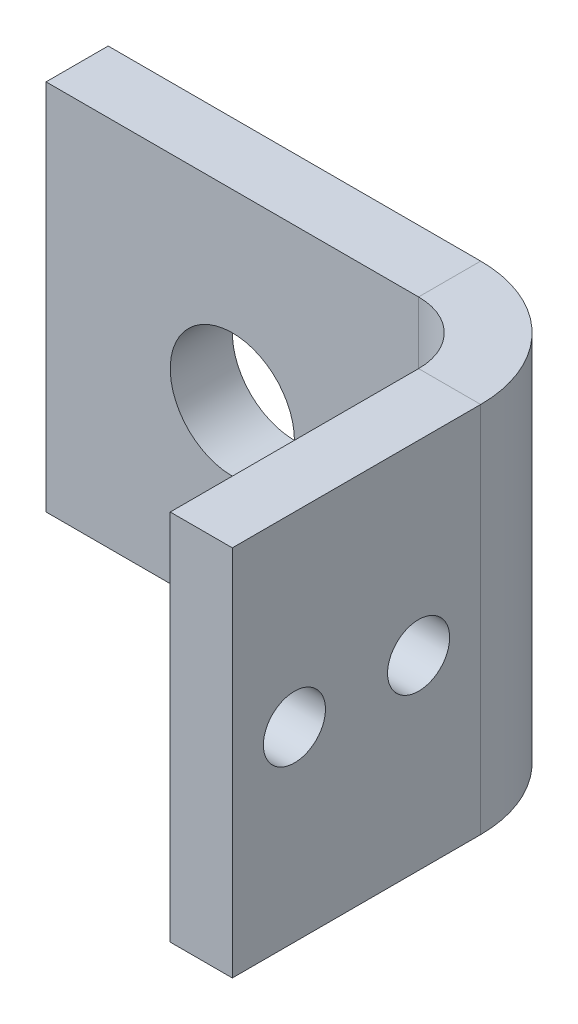
ISO-10303-21;
HEADER;
FILE_DESCRIPTION(('STEP AP214'),'2;1');
FILE_NAME('part.step','',(''),(''),'','','');
FILE_SCHEMA(('AUTOMOTIVE_DESIGN { 1 0 10303 214 1 1 1 1 }'));
ENDSEC;
DATA;
#1=APPLICATION_CONTEXT('core data for automotive mechanical design processes');
#2=APPLICATION_PROTOCOL_DEFINITION('international standard','automotive_design',2000,#1);
#3=PRODUCT_CONTEXT('',#1,'mechanical');
#4=PRODUCT('Part','Part','',(#3));
#5=PRODUCT_RELATED_PRODUCT_CATEGORY('part','',(#4));
#6=PRODUCT_DEFINITION_FORMATION('','',#4);
#7=PRODUCT_DEFINITION_CONTEXT('part definition',#1,'design');
#8=PRODUCT_DEFINITION('design','',#6,#7);
#9=PRODUCT_DEFINITION_SHAPE('','',#8);
#10=(LENGTH_UNIT() NAMED_UNIT(*) SI_UNIT(.MILLI.,.METRE.));
#11=(NAMED_UNIT(*) PLANE_ANGLE_UNIT() SI_UNIT($,.RADIAN.));
#12=(NAMED_UNIT(*) SI_UNIT($,.STERADIAN.) SOLID_ANGLE_UNIT());
#13=UNCERTAINTY_MEASURE_WITH_UNIT(LENGTH_MEASURE(1.E-05),#10,'distance_accuracy_value','');
#14=(GEOMETRIC_REPRESENTATION_CONTEXT(3) GLOBAL_UNCERTAINTY_ASSIGNED_CONTEXT((#13)) GLOBAL_UNIT_ASSIGNED_CONTEXT((#10,
#11,#12)) REPRESENTATION_CONTEXT('',''));
#15=CARTESIAN_POINT('',(0.,0.,0.));
#16=DIRECTION('',(0.,0.,1.));
#17=DIRECTION('',(1.,0.,0.));
#18=AXIS2_PLACEMENT_3D('',#15,#16,#17);
#19=CARTESIAN_POINT('',(-30.,-15.,-5.));
#20=DIRECTION('',(0.,-1.,0.));
#21=DIRECTION('',(1.,0.,0.));
#22=AXIS2_PLACEMENT_3D('',#19,#20,#21);
#23=PLANE('',#22);
#24=DIRECTION('',(1.,0.,0.));
#25=VECTOR('',#24,1.);
#26=CARTESIAN_POINT('',(-30.,-15.,0.));
#27=LINE('',#26,#25);
#28=CARTESIAN_POINT('',(-30.,-15.,0.));
#29=VERTEX_POINT('',#28);
#30=CARTESIAN_POINT('',(0.,-15.,0.));
#31=VERTEX_POINT('',#30);
#32=EDGE_CURVE('E200',#29,#31,#27,.T.);
#33=ORIENTED_EDGE('',*,*,#32,.F.);
#34=DIRECTION('',(0.,0.,1.));
#35=VECTOR('',#34,1.);
#36=CARTESIAN_POINT('',(-30.,-15.,-5.));
#37=LINE('',#36,#35);
#38=CARTESIAN_POINT('',(-30.,-15.,-5.));
#39=VERTEX_POINT('',#38);
#40=EDGE_CURVE('E73',#39,#29,#37,.T.);
#41=ORIENTED_EDGE('',*,*,#40,.F.);
#42=DIRECTION('',(1.,0.,0.));
#43=VECTOR('',#42,1.);
#44=CARTESIAN_POINT('',(-30.,-15.,-5.));
#45=LINE('',#44,#43);
#46=CARTESIAN_POINT('',(0.,-15.,-5.));
#47=VERTEX_POINT('',#46);
#48=EDGE_CURVE('E205',#39,#47,#45,.T.);
#49=ORIENTED_EDGE('',*,*,#48,.T.);
#50=DIRECTION('',(0.,0.,1.));
#51=VECTOR('',#50,1.);
#52=CARTESIAN_POINT('',(0.,-15.,-5.));
#53=LINE('',#52,#51);
#54=EDGE_CURVE('E13',#47,#31,#53,.T.);
#55=ORIENTED_EDGE('',*,*,#54,.T.);
#56=EDGE_LOOP('',(#33,#41,#49,#55));
#57=FACE_BOUND('',#56,.T.);
#58=ADVANCED_FACE('F63',(#57),#23,.T.);
#59=CARTESIAN_POINT('',(-30.,15.,-5.));
#60=DIRECTION('',(-1.,0.,0.));
#61=DIRECTION('',(0.,-1.,0.));
#62=AXIS2_PLACEMENT_3D('',#59,#60,#61);
#63=PLANE('',#62);
#64=DIRECTION('',(0.,-1.,0.));
#65=VECTOR('',#64,1.);
#66=CARTESIAN_POINT('',(-30.,15.,0.));
#67=LINE('',#66,#65);
#68=CARTESIAN_POINT('',(-30.,15.,0.));
#69=VERTEX_POINT('',#68);
#70=EDGE_CURVE('E212',#69,#29,#67,.T.);
#71=ORIENTED_EDGE('',*,*,#70,.F.);
#72=DIRECTION('',(0.,0.,1.));
#73=VECTOR('',#72,1.);
#74=CARTESIAN_POINT('',(-30.,15.,-5.));
#75=LINE('',#74,#73);
#76=CARTESIAN_POINT('',(-30.,15.,-5.));
#77=VERTEX_POINT('',#76);
#78=EDGE_CURVE('E106',#77,#69,#75,.T.);
#79=ORIENTED_EDGE('',*,*,#78,.F.);
#80=DIRECTION('',(0.,-1.,0.));
#81=VECTOR('',#80,1.);
#82=CARTESIAN_POINT('',(-30.,15.,-5.));
#83=LINE('',#82,#81);
#84=EDGE_CURVE('E203',#77,#39,#83,.T.);
#85=ORIENTED_EDGE('',*,*,#84,.T.);
#86=ORIENTED_EDGE('',*,*,#40,.T.);
#87=EDGE_LOOP('',(#71,#79,#85,#86));
#88=FACE_BOUND('',#87,.T.);
#89=ADVANCED_FACE('F267',(#88),#63,.T.);
#90=CARTESIAN_POINT('',(-30.,15.,-5.));
#91=DIRECTION('',(0.,1.,0.));
#92=DIRECTION('',(-1.,0.,0.));
#93=AXIS2_PLACEMENT_3D('',#90,#91,#92);
#94=PLANE('',#93);
#95=DIRECTION('',(-1.,0.,0.));
#96=VECTOR('',#95,1.);
#97=CARTESIAN_POINT('',(-30.,15.,0.));
#98=LINE('',#97,#96);
#99=CARTESIAN_POINT('',(0.,15.,0.));
#100=VERTEX_POINT('',#99);
#101=EDGE_CURVE('E209',#100,#69,#98,.T.);
#102=ORIENTED_EDGE('',*,*,#101,.F.);
#103=DIRECTION('',(0.,0.,1.));
#104=VECTOR('',#103,1.);
#105=CARTESIAN_POINT('',(0.,15.,-5.));
#106=LINE('',#105,#104);
#107=CARTESIAN_POINT('',(0.,15.,-5.));
#108=VERTEX_POINT('',#107);
#109=EDGE_CURVE('E67',#108,#100,#106,.T.);
#110=ORIENTED_EDGE('',*,*,#109,.F.);
#111=DIRECTION('',(-1.,0.,0.));
#112=VECTOR('',#111,1.);
#113=CARTESIAN_POINT('',(-30.,15.,-5.));
#114=LINE('',#113,#112);
#115=EDGE_CURVE('E199',#108,#77,#114,.T.);
#116=ORIENTED_EDGE('',*,*,#115,.T.);
#117=ORIENTED_EDGE('',*,*,#78,.T.);
#118=EDGE_LOOP('',(#102,#110,#116,#117));
#119=FACE_BOUND('',#118,.T.);
#120=ADVANCED_FACE('F65',(#119),#94,.T.);
#121=CARTESIAN_POINT('',(0.,0.,-5.));
#122=DIRECTION('',(0.,0.,1.));
#123=DIRECTION('',(1.,0.,0.));
#124=AXIS2_PLACEMENT_3D('',#121,#122,#123);
#125=PLANE('',#124);
#126=CARTESIAN_POINT('',(-15.,0.,-5.));
#127=DIRECTION('',(0.,0.,1.));
#128=DIRECTION('',(1.,0.,0.));
#129=AXIS2_PLACEMENT_3D('',#126,#127,#128);
#130=CIRCLE('',#129,5.);
#131=CARTESIAN_POINT('',(-9.99999999999999,0.,-5.));
#132=VERTEX_POINT('',#131);
#133=EDGE_CURVE('E192',#132,#132,#130,.T.);
#134=ORIENTED_EDGE('',*,*,#133,.T.);
#135=EDGE_LOOP('',(#134));
#136=FACE_BOUND('',#135,.T.);
#137=DIRECTION('',(0.,1.,0.));
#138=VECTOR('',#137,1.);
#139=CARTESIAN_POINT('',(0.,15.,-5.));
#140=LINE('',#139,#138);
#141=EDGE_CURVE('E82',#47,#108,#140,.T.);
#142=ORIENTED_EDGE('',*,*,#141,.F.);
#143=ORIENTED_EDGE('',*,*,#48,.F.);
#144=ORIENTED_EDGE('',*,*,#84,.F.);
#145=ORIENTED_EDGE('',*,*,#115,.F.);
#146=EDGE_LOOP('',(#142,#143,#144,#145));
#147=FACE_BOUND('',#146,.T.);
#148=ADVANCED_FACE('F279',(#136,#147),#125,.F.);
#149=CARTESIAN_POINT('',(0.,0.,0.));
#150=DIRECTION('',(0.,0.,1.));
#151=DIRECTION('',(1.,0.,0.));
#152=AXIS2_PLACEMENT_3D('',#149,#150,#151);
#153=PLANE('',#152);
#154=CARTESIAN_POINT('',(-15.,0.,0.));
#155=DIRECTION('',(0.,0.,1.));
#156=DIRECTION('',(1.,0.,0.));
#157=AXIS2_PLACEMENT_3D('',#154,#155,#156);
#158=CIRCLE('',#157,5.);
#159=CARTESIAN_POINT('',(-9.99999999999999,0.,0.));
#160=VERTEX_POINT('',#159);
#161=EDGE_CURVE('E182',#160,#160,#158,.T.);
#162=ORIENTED_EDGE('',*,*,#161,.F.);
#163=EDGE_LOOP('',(#162));
#164=FACE_BOUND('',#163,.T.);
#165=DIRECTION('',(0.,1.,0.));
#166=VECTOR('',#165,1.);
#167=CARTESIAN_POINT('',(0.,15.,0.));
#168=LINE('',#167,#166);
#169=EDGE_CURVE('E195',#31,#100,#168,.T.);
#170=ORIENTED_EDGE('',*,*,#169,.T.);
#171=ORIENTED_EDGE('',*,*,#101,.T.);
#172=ORIENTED_EDGE('',*,*,#70,.T.);
#173=ORIENTED_EDGE('',*,*,#32,.T.);
#174=EDGE_LOOP('',(#170,#171,#172,#173));
#175=FACE_BOUND('',#174,.T.);
#176=ADVANCED_FACE('F275',(#164,#175),#153,.T.);
#177=CARTESIAN_POINT('',(-15.,0.,-5.));
#178=DIRECTION('',(0.,0.,1.));
#179=DIRECTION('',(1.,0.,0.));
#180=AXIS2_PLACEMENT_3D('',#177,#178,#179);
#181=CYLINDRICAL_SURFACE('',#180,5.);
#182=ORIENTED_EDGE('',*,*,#133,.F.);
#183=EDGE_LOOP('',(#182));
#184=FACE_BOUND('',#183,.T.);
#185=ORIENTED_EDGE('',*,*,#161,.T.);
#186=EDGE_LOOP('',(#185));
#187=FACE_BOUND('',#186,.T.);
#188=ADVANCED_FACE('F278',(#184,#187),#181,.F.);
#189=CARTESIAN_POINT('',(0.,-15.,5.));
#190=DIRECTION('',(0.,-1.,0.));
#191=DIRECTION('',(1.,0.,0.));
#192=AXIS2_PLACEMENT_3D('',#189,#190,#191);
#193=PLANE('',#192);
#194=DIRECTION('',(-1.,0.,0.));
#195=VECTOR('',#194,1.);
#196=CARTESIAN_POINT('',(10.,-15.,4.99999999999997));
#197=LINE('',#196,#195);
#198=CARTESIAN_POINT('',(5.,-15.,4.99999999999998));
#199=VERTEX_POINT('',#198);
#200=CARTESIAN_POINT('',(10.,-15.,4.99999999999997));
#201=VERTEX_POINT('',#200);
#202=EDGE_CURVE('E160',#199,#201,#197,.F.);
#203=ORIENTED_EDGE('',*,*,#202,.F.);
#204=CARTESIAN_POINT('',(0.,-15.,5.));
#205=DIRECTION('',(0.,1.,0.));
#206=DIRECTION('',(-1.,0.,0.));
#207=AXIS2_PLACEMENT_3D('',#204,#205,#206);
#208=CIRCLE('',#207,5.);
#209=EDGE_CURVE('E186',#31,#199,#208,.F.);
#210=ORIENTED_EDGE('',*,*,#209,.F.);
#211=ORIENTED_EDGE('',*,*,#54,.F.);
#212=CARTESIAN_POINT('',(0.,-15.,5.));
#213=DIRECTION('',(0.,1.,0.));
#214=DIRECTION('',(-1.,0.,0.));
#215=AXIS2_PLACEMENT_3D('',#212,#213,#214);
#216=CIRCLE('',#215,10.);
#217=EDGE_CURVE('E179',#47,#201,#216,.F.);
#218=ORIENTED_EDGE('',*,*,#217,.T.);
#219=EDGE_LOOP('',(#203,#210,#211,#218));
#220=FACE_BOUND('',#219,.T.);
#221=ADVANCED_FACE('F285',(#220),#193,.T.);
#222=CARTESIAN_POINT('',(0.,15.,5.));
#223=DIRECTION('',(0.,-1.,0.));
#224=DIRECTION('',(1.,0.,0.));
#225=AXIS2_PLACEMENT_3D('',#222,#223,#224);
#226=PLANE('',#225);
#227=CARTESIAN_POINT('',(0.,15.,5.));
#228=DIRECTION('',(0.,1.,0.));
#229=DIRECTION('',(-1.,0.,0.));
#230=AXIS2_PLACEMENT_3D('',#227,#228,#229);
#231=CIRCLE('',#230,5.);
#232=CARTESIAN_POINT('',(4.99999999999999,15.,4.99999999999998));
#233=VERTEX_POINT('',#232);
#234=EDGE_CURVE('E189',#233,#100,#231,.T.);
#235=ORIENTED_EDGE('',*,*,#234,.F.);
#236=DIRECTION('',(-1.,0.,0.));
#237=VECTOR('',#236,1.);
#238=CARTESIAN_POINT('',(4.99999999999999,15.,4.99999999999998));
#239=LINE('',#238,#237);
#240=CARTESIAN_POINT('',(9.99999999999999,15.,4.99999999999997));
#241=VERTEX_POINT('',#240);
#242=EDGE_CURVE('E172',#233,#241,#239,.F.);
#243=ORIENTED_EDGE('',*,*,#242,.T.);
#244=CARTESIAN_POINT('',(0.,15.,5.));
#245=DIRECTION('',(0.,1.,0.));
#246=DIRECTION('',(-1.,0.,0.));
#247=AXIS2_PLACEMENT_3D('',#244,#245,#246);
#248=CIRCLE('',#247,10.);
#249=EDGE_CURVE('E183',#241,#108,#248,.T.);
#250=ORIENTED_EDGE('',*,*,#249,.T.);
#251=ORIENTED_EDGE('',*,*,#109,.T.);
#252=EDGE_LOOP('',(#235,#243,#250,#251));
#253=FACE_BOUND('',#252,.T.);
#254=ADVANCED_FACE('F220',(#253),#226,.F.);
#255=CARTESIAN_POINT('',(0.,15.,5.));
#256=DIRECTION('',(0.,1.,0.));
#257=DIRECTION('',(1.,0.,0.));
#258=AXIS2_PLACEMENT_3D('',#255,#256,#257);
#259=CYLINDRICAL_SURFACE('',#258,10.);
#260=ORIENTED_EDGE('',*,*,#141,.T.);
#261=ORIENTED_EDGE('',*,*,#249,.F.);
#262=DIRECTION('',(0.,1.,0.));
#263=VECTOR('',#262,1.);
#264=CARTESIAN_POINT('',(10.,-15.,4.99999999999997));
#265=LINE('',#264,#263);
#266=EDGE_CURVE('E170',#241,#201,#265,.F.);
#267=ORIENTED_EDGE('',*,*,#266,.T.);
#268=ORIENTED_EDGE('',*,*,#217,.F.);
#269=EDGE_LOOP('',(#260,#261,#267,#268));
#270=FACE_BOUND('',#269,.T.);
#271=ADVANCED_FACE('F289',(#270),#259,.T.);
#272=CARTESIAN_POINT('',(0.,15.,5.));
#273=DIRECTION('',(0.,1.,0.));
#274=DIRECTION('',(1.,0.,0.));
#275=AXIS2_PLACEMENT_3D('',#272,#273,#274);
#276=CYLINDRICAL_SURFACE('',#275,5.);
#277=ORIENTED_EDGE('',*,*,#169,.F.);
#278=ORIENTED_EDGE('',*,*,#209,.T.);
#279=DIRECTION('',(0.,1.,0.));
#280=VECTOR('',#279,1.);
#281=CARTESIAN_POINT('',(5.,-15.,4.99999999999998));
#282=LINE('',#281,#280);
#283=EDGE_CURVE('E175',#199,#233,#282,.T.);
#284=ORIENTED_EDGE('',*,*,#283,.T.);
#285=ORIENTED_EDGE('',*,*,#234,.T.);
#286=EDGE_LOOP('',(#277,#278,#284,#285));
#287=FACE_BOUND('',#286,.T.);
#288=ADVANCED_FACE('F224',(#287),#276,.F.);
#289=CARTESIAN_POINT('',(10.0000000000001,15.,25.));
#290=DIRECTION('',(0.,-1.,0.));
#291=DIRECTION('',(1.,0.,0.));
#292=AXIS2_PLACEMENT_3D('',#289,#290,#291);
#293=PLANE('',#292);
#294=ORIENTED_EDGE('',*,*,#242,.F.);
#295=DIRECTION('',(0.,0.,-1.));
#296=VECTOR('',#295,1.);
#297=CARTESIAN_POINT('',(5.00000000000007,15.,25.));
#298=LINE('',#297,#296);
#299=CARTESIAN_POINT('',(5.00000000000006,15.,25.));
#300=VERTEX_POINT('',#299);
#301=EDGE_CURVE('E168',#233,#300,#298,.F.);
#302=ORIENTED_EDGE('',*,*,#301,.T.);
#303=DIRECTION('',(-1.,0.,0.));
#304=VECTOR('',#303,1.);
#305=CARTESIAN_POINT('',(10.0000000000001,15.,25.));
#306=LINE('',#305,#304);
#307=CARTESIAN_POINT('',(10.0000000000001,15.,25.));
#308=VERTEX_POINT('',#307);
#309=EDGE_CURVE('E156',#308,#300,#306,.T.);
#310=ORIENTED_EDGE('',*,*,#309,.F.);
#311=DIRECTION('',(0.,0.,1.));
#312=VECTOR('',#311,1.);
#313=CARTESIAN_POINT('',(9.99999999999998,15.,0.));
#314=LINE('',#313,#312);
#315=EDGE_CURVE('E143',#241,#308,#314,.T.);
#316=ORIENTED_EDGE('',*,*,#315,.F.);
#317=EDGE_LOOP('',(#294,#302,#310,#316));
#318=FACE_BOUND('',#317,.T.);
#319=ADVANCED_FACE('F231',(#318),#293,.F.);
#320=CARTESIAN_POINT('',(9.99999999999999,-15.,0.));
#321=DIRECTION('',(0.,1.,0.));
#322=DIRECTION('',(-1.,0.,0.));
#323=AXIS2_PLACEMENT_3D('',#320,#321,#322);
#324=PLANE('',#323);
#325=ORIENTED_EDGE('',*,*,#202,.T.);
#326=DIRECTION('',(0.,0.,-1.));
#327=VECTOR('',#326,1.);
#328=CARTESIAN_POINT('',(9.99999999999999,-15.,0.));
#329=LINE('',#328,#327);
#330=CARTESIAN_POINT('',(10.0000000000001,-15.,25.));
#331=VERTEX_POINT('',#330);
#332=EDGE_CURVE('E141',#331,#201,#329,.T.);
#333=ORIENTED_EDGE('',*,*,#332,.F.);
#334=DIRECTION('',(-1.,0.,0.));
#335=VECTOR('',#334,1.);
#336=CARTESIAN_POINT('',(10.0000000000001,-15.,25.));
#337=LINE('',#336,#335);
#338=CARTESIAN_POINT('',(5.00000000000007,-15.,25.));
#339=VERTEX_POINT('',#338);
#340=EDGE_CURVE('E149',#331,#339,#337,.T.);
#341=ORIENTED_EDGE('',*,*,#340,.T.);
#342=DIRECTION('',(0.,0.,1.));
#343=VECTOR('',#342,1.);
#344=CARTESIAN_POINT('',(4.99999999999999,-15.,0.));
#345=LINE('',#344,#343);
#346=EDGE_CURVE('E165',#339,#199,#345,.F.);
#347=ORIENTED_EDGE('',*,*,#346,.T.);
#348=EDGE_LOOP('',(#325,#333,#341,#347));
#349=FACE_BOUND('',#348,.T.);
#350=ADVANCED_FACE('F159',(#349),#324,.F.);
#351=CARTESIAN_POINT('',(9.99999999999998,0.,0.));
#352=DIRECTION('',(-1.,0.,0.));
#353=DIRECTION('',(0.,0.,1.));
#354=AXIS2_PLACEMENT_3D('',#351,#352,#353);
#355=PLANE('',#354);
#356=CARTESIAN_POINT('',(10.0000000000001,0.,20.));
#357=DIRECTION('',(-1.,0.,0.));
#358=DIRECTION('',(0.,0.,1.));
#359=AXIS2_PLACEMENT_3D('',#356,#357,#358);
#360=CIRCLE('',#359,2.5);
#361=CARTESIAN_POINT('',(10.0000000000001,0.,22.5));
#362=VERTEX_POINT('',#361);
#363=EDGE_CURVE('E238',#362,#362,#360,.T.);
#364=ORIENTED_EDGE('',*,*,#363,.T.);
#365=EDGE_LOOP('',(#364));
#366=FACE_BOUND('',#365,.T.);
#367=CARTESIAN_POINT('',(10.,0.,10.));
#368=DIRECTION('',(-1.,0.,0.));
#369=DIRECTION('',(0.,0.,1.));
#370=AXIS2_PLACEMENT_3D('',#367,#368,#369);
#371=CIRCLE('',#370,2.5);
#372=CARTESIAN_POINT('',(10.,0.,12.5));
#373=VERTEX_POINT('',#372);
#374=EDGE_CURVE('E178',#373,#373,#371,.T.);
#375=ORIENTED_EDGE('',*,*,#374,.T.);
#376=EDGE_LOOP('',(#375));
#377=FACE_BOUND('',#376,.T.);
#378=ORIENTED_EDGE('',*,*,#266,.F.);
#379=ORIENTED_EDGE('',*,*,#315,.T.);
#380=DIRECTION('',(0.,-1.,0.));
#381=VECTOR('',#380,1.);
#382=CARTESIAN_POINT('',(10.0000000000001,0.,25.));
#383=LINE('',#382,#381);
#384=EDGE_CURVE('E136',#308,#331,#383,.T.);
#385=ORIENTED_EDGE('',*,*,#384,.T.);
#386=ORIENTED_EDGE('',*,*,#332,.T.);
#387=EDGE_LOOP('',(#378,#379,#385,#386));
#388=FACE_BOUND('',#387,.T.);
#389=ADVANCED_FACE('F139',(#366,#377,#388),#355,.F.);
#390=CARTESIAN_POINT('',(4.99999999999998,0.,0.));
#391=DIRECTION('',(-1.,0.,0.));
#392=DIRECTION('',(0.,0.,1.));
#393=AXIS2_PLACEMENT_3D('',#390,#391,#392);
#394=PLANE('',#393);
#395=CARTESIAN_POINT('',(5.00000000000005,0.,20.));
#396=DIRECTION('',(-1.,0.,0.));
#397=DIRECTION('',(0.,0.,1.));
#398=AXIS2_PLACEMENT_3D('',#395,#396,#397);
#399=CIRCLE('',#398,2.5);
#400=CARTESIAN_POINT('',(5.00000000000006,0.,22.5));
#401=VERTEX_POINT('',#400);
#402=EDGE_CURVE('E241',#401,#401,#399,.T.);
#403=ORIENTED_EDGE('',*,*,#402,.F.);
#404=EDGE_LOOP('',(#403));
#405=FACE_BOUND('',#404,.T.);
#406=CARTESIAN_POINT('',(5.00000000000002,0.,10.));
#407=DIRECTION('',(-1.,0.,0.));
#408=DIRECTION('',(0.,0.,1.));
#409=AXIS2_PLACEMENT_3D('',#406,#407,#408);
#410=CIRCLE('',#409,2.5);
#411=CARTESIAN_POINT('',(5.00000000000003,0.,12.5));
#412=VERTEX_POINT('',#411);
#413=EDGE_CURVE('E235',#412,#412,#410,.T.);
#414=ORIENTED_EDGE('',*,*,#413,.F.);
#415=EDGE_LOOP('',(#414));
#416=FACE_BOUND('',#415,.T.);
#417=ORIENTED_EDGE('',*,*,#301,.F.);
#418=ORIENTED_EDGE('',*,*,#283,.F.);
#419=ORIENTED_EDGE('',*,*,#346,.F.);
#420=DIRECTION('',(0.,1.,0.));
#421=VECTOR('',#420,1.);
#422=CARTESIAN_POINT('',(5.00000000000007,-15.,25.));
#423=LINE('',#422,#421);
#424=EDGE_CURVE('E152',#300,#339,#423,.F.);
#425=ORIENTED_EDGE('',*,*,#424,.F.);
#426=EDGE_LOOP('',(#417,#418,#419,#425));
#427=FACE_BOUND('',#426,.T.);
#428=ADVANCED_FACE('F229',(#405,#416,#427),#394,.T.);
#429=CARTESIAN_POINT('',(10.0000000000001,-15.,25.));
#430=DIRECTION('',(0.,0.,-1.));
#431=DIRECTION('',(-1.,0.,0.));
#432=AXIS2_PLACEMENT_3D('',#429,#430,#431);
#433=PLANE('',#432);
#434=ORIENTED_EDGE('',*,*,#424,.T.);
#435=ORIENTED_EDGE('',*,*,#340,.F.);
#436=ORIENTED_EDGE('',*,*,#384,.F.);
#437=ORIENTED_EDGE('',*,*,#309,.T.);
#438=EDGE_LOOP('',(#434,#435,#436,#437));
#439=FACE_BOUND('',#438,.T.);
#440=ADVANCED_FACE('F150',(#439),#433,.F.);
#441=CARTESIAN_POINT('',(15.,0.,9.99999999999998));
#442=DIRECTION('',(-1.,0.,0.));
#443=DIRECTION('',(0.,0.,1.));
#444=AXIS2_PLACEMENT_3D('',#441,#442,#443);
#445=CYLINDRICAL_SURFACE('',#444,2.5);
#446=ORIENTED_EDGE('',*,*,#413,.T.);
#447=EDGE_LOOP('',(#446));
#448=FACE_BOUND('',#447,.T.);
#449=ORIENTED_EDGE('',*,*,#374,.F.);
#450=EDGE_LOOP('',(#449));
#451=FACE_BOUND('',#450,.T.);
#452=ADVANCED_FACE('F253',(#448,#451),#445,.F.);
#453=CARTESIAN_POINT('',(15.0000000000001,0.,20.));
#454=DIRECTION('',(-1.,0.,0.));
#455=DIRECTION('',(0.,0.,1.));
#456=AXIS2_PLACEMENT_3D('',#453,#454,#455);
#457=CYLINDRICAL_SURFACE('',#456,2.5);
#458=ORIENTED_EDGE('',*,*,#402,.T.);
#459=EDGE_LOOP('',(#458));
#460=FACE_BOUND('',#459,.T.);
#461=ORIENTED_EDGE('',*,*,#363,.F.);
#462=EDGE_LOOP('',(#461));
#463=FACE_BOUND('',#462,.T.);
#464=ADVANCED_FACE('F245',(#460,#463),#457,.F.);
#465=CLOSED_SHELL('',(#58,#89,#120,#148,#176,#188,#221,#254,#271,#288,#319,#350,#389,#428,#440,
#452,#464));
#466=MANIFOLD_SOLID_BREP('B2',#465);
#467=ADVANCED_BREP_SHAPE_REPRESENTATION('',(#18,#466),#14);
#468=SHAPE_DEFINITION_REPRESENTATION(#9,#467);
ENDSEC;
END-ISO-10303-21;
